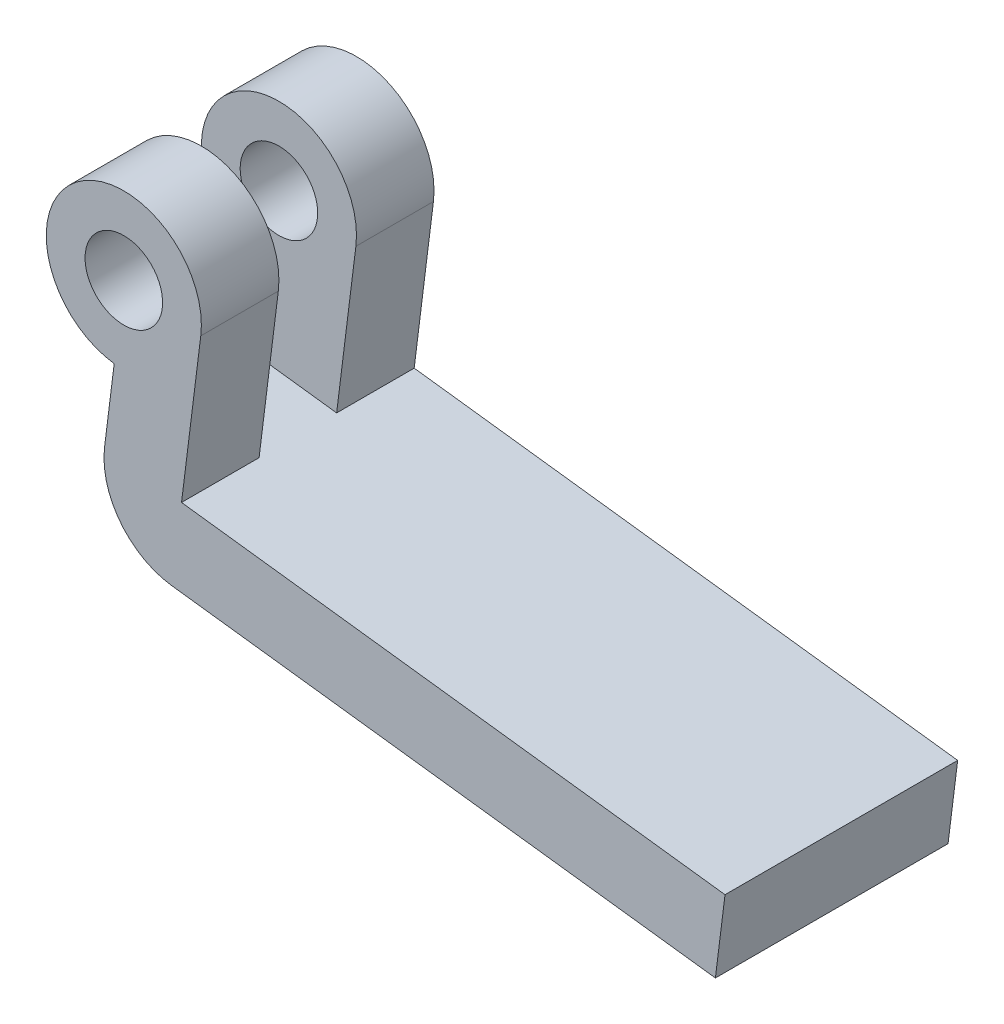
ISO-10303-21;
HEADER;
FILE_DESCRIPTION(('STEP AP214'),'2;1');
FILE_NAME('part.step','',(''),(''),'','','');
FILE_SCHEMA(('AUTOMOTIVE_DESIGN { 1 0 10303 214 1 1 1 1 }'));
ENDSEC;
DATA;
#1=APPLICATION_CONTEXT('core data for automotive mechanical design processes');
#2=APPLICATION_PROTOCOL_DEFINITION('international standard','automotive_design',2000,#1);
#3=PRODUCT_CONTEXT('',#1,'mechanical');
#4=PRODUCT('Part','Part','',(#3));
#5=PRODUCT_RELATED_PRODUCT_CATEGORY('part','',(#4));
#6=PRODUCT_DEFINITION_FORMATION('','',#4);
#7=PRODUCT_DEFINITION_CONTEXT('part definition',#1,'design');
#8=PRODUCT_DEFINITION('design','',#6,#7);
#9=PRODUCT_DEFINITION_SHAPE('','',#8);
#10=(LENGTH_UNIT() NAMED_UNIT(*) SI_UNIT(.MILLI.,.METRE.));
#11=(NAMED_UNIT(*) PLANE_ANGLE_UNIT() SI_UNIT($,.RADIAN.));
#12=(NAMED_UNIT(*) SI_UNIT($,.STERADIAN.) SOLID_ANGLE_UNIT());
#13=UNCERTAINTY_MEASURE_WITH_UNIT(LENGTH_MEASURE(1.E-05),#10,'distance_accuracy_value','');
#14=(GEOMETRIC_REPRESENTATION_CONTEXT(3) GLOBAL_UNCERTAINTY_ASSIGNED_CONTEXT((#13)) GLOBAL_UNIT_ASSIGNED_CONTEXT((#10,
#11,#12)) REPRESENTATION_CONTEXT('',''));
#15=CARTESIAN_POINT('',(0.,0.,0.));
#16=DIRECTION('',(0.,0.,1.));
#17=DIRECTION('',(1.,0.,0.));
#18=AXIS2_PLACEMENT_3D('',#15,#16,#17);
#19=CARTESIAN_POINT('',(-2.3628616939244,-18.9028935513954,9.525));
#20=DIRECTION('',(0.992277876713668,-0.124034734589207,0.));
#21=DIRECTION('',(0.124034734589207,0.992277876713668,0.));
#22=AXIS2_PLACEMENT_3D('',#19,#20,#21);
#23=PLANE('',#22);
#24=DIRECTION('',(-0.124034734589207,-0.992277876713668,0.));
#25=VECTOR('',#24,1.);
#26=CARTESIAN_POINT('',(-2.3628616939244,-18.9028935513954,-9.525));
#27=LINE('',#26,#25);
#28=CARTESIAN_POINT('',(-0.787620564641476,-6.30096451713179,-9.525));
#29=VERTEX_POINT('',#28);
#30=CARTESIAN_POINT('',(-1.57524112928294,-12.6019290342636,-9.525));
#31=VERTEX_POINT('',#30);
#32=EDGE_CURVE('E186',#29,#31,#27,.T.);
#33=ORIENTED_EDGE('',*,*,#32,.T.);
#34=DIRECTION('',(0.,0.,-1.));
#35=VECTOR('',#34,1.);
#36=CARTESIAN_POINT('',(-1.57524112928294,-12.6019290342636,9.525));
#37=LINE('',#36,#35);
#38=CARTESIAN_POINT('',(-1.57524112928294,-12.6019290342636,-3.175));
#39=VERTEX_POINT('',#38);
#40=EDGE_CURVE('E51',#31,#39,#37,.F.);
#41=ORIENTED_EDGE('',*,*,#40,.T.);
#42=DIRECTION('',(0.124034734589207,0.992277876713668,0.));
#43=VECTOR('',#42,1.);
#44=CARTESIAN_POINT('',(-2.3628616939244,-18.9028935513954,-3.175));
#45=LINE('',#44,#43);
#46=CARTESIAN_POINT('',(-0.787620564641472,-6.30096451713179,-3.175));
#47=VERTEX_POINT('',#46);
#48=EDGE_CURVE('E175',#39,#47,#45,.T.);
#49=ORIENTED_EDGE('',*,*,#48,.T.);
#50=DIRECTION('',(0.,0.,-1.));
#51=VECTOR('',#50,1.);
#52=CARTESIAN_POINT('',(-0.787620564641476,-6.30096451713179,9.525));
#53=LINE('',#52,#51);
#54=EDGE_CURVE('E257',#47,#29,#53,.T.);
#55=ORIENTED_EDGE('',*,*,#54,.T.);
#56=EDGE_LOOP('',(#33,#41,#49,#55));
#57=FACE_BOUND('',#56,.T.);
#58=ADVANCED_FACE('F42',(#57),#23,.F.);
#59=CARTESIAN_POINT('',(6.30096451713179,-0.787620564641473,9.525));
#60=DIRECTION('',(-0.992277876713668,0.124034734589208,0.));
#61=DIRECTION('',(-0.124034734589208,-0.992277876713668,0.));
#62=AXIS2_PLACEMENT_3D('',#59,#60,#61);
#63=PLANE('',#62);
#64=DIRECTION('',(-0.124034734589208,-0.992277876713668,0.));
#65=VECTOR('',#64,1.);
#66=CARTESIAN_POINT('',(6.30096451713179,-0.787620564641473,3.175));
#67=LINE('',#66,#65);
#68=CARTESIAN_POINT('',(6.30096451713179,-0.787620564641474,3.175));
#69=VERTEX_POINT('',#68);
#70=CARTESIAN_POINT('',(4.72572338784885,-13.3895495989051,3.175));
#71=VERTEX_POINT('',#70);
#72=EDGE_CURVE('E127',#69,#71,#67,.T.);
#73=ORIENTED_EDGE('',*,*,#72,.F.);
#74=DIRECTION('',(0.,0.,-1.));
#75=VECTOR('',#74,1.);
#76=CARTESIAN_POINT('',(6.30096451713179,-0.787620564641473,9.525));
#77=LINE('',#76,#75);
#78=CARTESIAN_POINT('',(6.30096451713179,-0.787620564641473,9.525));
#79=VERTEX_POINT('',#78);
#80=EDGE_CURVE('E164',#79,#69,#77,.T.);
#81=ORIENTED_EDGE('',*,*,#80,.F.);
#82=DIRECTION('',(0.124034734589208,0.992277876713668,0.));
#83=VECTOR('',#82,1.);
#84=CARTESIAN_POINT('',(6.30096451713179,-0.787620564641473,9.525));
#85=LINE('',#84,#83);
#86=CARTESIAN_POINT('',(4.72572338784885,-13.3895495989051,9.525));
#87=VERTEX_POINT('',#86);
#88=EDGE_CURVE('E154',#87,#79,#85,.T.);
#89=ORIENTED_EDGE('',*,*,#88,.F.);
#90=DIRECTION('',(0.,0.,-1.));
#91=VECTOR('',#90,1.);
#92=CARTESIAN_POINT('',(4.72572338784885,-13.3895495989051,9.525));
#93=LINE('',#92,#91);
#94=EDGE_CURVE('E146',#87,#71,#93,.T.);
#95=ORIENTED_EDGE('',*,*,#94,.T.);
#96=EDGE_LOOP('',(#73,#81,#89,#95));
#97=FACE_BOUND('',#96,.T.);
#98=ADVANCED_FACE('F153',(#97),#63,.F.);
#99=CARTESIAN_POINT('',(0.,0.,9.525));
#100=DIRECTION('',(0.,0.,-1.));
#101=DIRECTION('',(-1.,0.,0.));
#102=AXIS2_PLACEMENT_3D('',#99,#100,#101);
#103=CYLINDRICAL_SURFACE('',#102,6.35);
#104=CARTESIAN_POINT('',(0.,0.,3.175));
#105=DIRECTION('',(0.,0.,-1.));
#106=DIRECTION('',(-1.,0.,0.));
#107=AXIS2_PLACEMENT_3D('',#104,#105,#106);
#108=CIRCLE('',#107,6.35);
#109=CARTESIAN_POINT('',(-0.787620564641472,-6.30096451713179,3.175));
#110=VERTEX_POINT('',#109);
#111=EDGE_CURVE('E133',#110,#69,#108,.T.);
#112=ORIENTED_EDGE('',*,*,#111,.F.);
#113=CARTESIAN_POINT('',(-0.787620564641476,-6.30096451713179,9.525));
#114=VERTEX_POINT('',#113);
#115=EDGE_CURVE('E258',#114,#110,#53,.T.);
#116=ORIENTED_EDGE('',*,*,#115,.F.);
#117=CARTESIAN_POINT('',(0.,0.,9.525));
#118=DIRECTION('',(0.,0.,1.));
#119=DIRECTION('',(1.,0.,0.));
#120=AXIS2_PLACEMENT_3D('',#117,#118,#119);
#121=CIRCLE('',#120,6.35);
#122=EDGE_CURVE('E221',#79,#114,#121,.T.);
#123=ORIENTED_EDGE('',*,*,#122,.F.);
#124=ORIENTED_EDGE('',*,*,#80,.T.);
#125=EDGE_LOOP('',(#112,#116,#123,#124));
#126=FACE_BOUND('',#125,.T.);
#127=ADVANCED_FACE('F298',(#126),#103,.T.);
#128=CARTESIAN_POINT('',(0.,0.,9.525));
#129=DIRECTION('',(0.,0.,-1.));
#130=DIRECTION('',(-1.,0.,0.));
#131=AXIS2_PLACEMENT_3D('',#128,#129,#130);
#132=CYLINDRICAL_SURFACE('',#131,3.175);
#133=CARTESIAN_POINT('',(0.,0.,9.525));
#134=DIRECTION('',(0.,0.,1.));
#135=DIRECTION('',(1.,0.,0.));
#136=AXIS2_PLACEMENT_3D('',#133,#134,#135);
#137=CIRCLE('',#136,3.175);
#138=CARTESIAN_POINT('',(-3.175,0.,9.525));
#139=VERTEX_POINT('',#138);
#140=EDGE_CURVE('E206',#139,#139,#137,.T.);
#141=CARTESIAN_POINT('',(0.,0.,3.175));
#142=DIRECTION('',(0.,0.,-1.));
#143=DIRECTION('',(-1.,0.,0.));
#144=AXIS2_PLACEMENT_3D('',#141,#142,#143);
#145=CIRCLE('',#144,3.175);
#146=CARTESIAN_POINT('',(-3.175,0.,3.175));
#147=VERTEX_POINT('',#146);
#148=EDGE_CURVE('E168',#147,#147,#145,.T.);
#149=CARTESIAN_POINT('',(-3.175,0.,9.525));
#150=CARTESIAN_POINT('',(-3.175,0.,9.45885416666667));
#151=CARTESIAN_POINT('',(-3.175,0.,9.39270833333333));
#152=CARTESIAN_POINT('',(-3.175,0.,9.26041666666667));
#153=CARTESIAN_POINT('',(-3.175,0.,9.19427083333333));
#154=CARTESIAN_POINT('',(-3.175,0.,9.06197916666667));
#155=CARTESIAN_POINT('',(-3.175,0.,8.99583333333333));
#156=CARTESIAN_POINT('',(-3.175,0.,8.86354166666667));
#157=CARTESIAN_POINT('',(-3.175,0.,8.79739583333333));
#158=CARTESIAN_POINT('',(-3.175,0.,8.66510416666667));
#159=CARTESIAN_POINT('',(-3.175,0.,8.59895833333333));
#160=CARTESIAN_POINT('',(-3.175,0.,8.46666666666667));
#161=CARTESIAN_POINT('',(-3.175,0.,8.40052083333333));
#162=CARTESIAN_POINT('',(-3.175,0.,8.26822916666667));
#163=CARTESIAN_POINT('',(-3.175,0.,8.20208333333333));
#164=CARTESIAN_POINT('',(-3.175,0.,8.06979166666667));
#165=CARTESIAN_POINT('',(-3.175,0.,8.00364583333333));
#166=CARTESIAN_POINT('',(-3.175,0.,7.87135416666667));
#167=CARTESIAN_POINT('',(-3.175,0.,7.80520833333333));
#168=CARTESIAN_POINT('',(-3.175,0.,7.67291666666667));
#169=CARTESIAN_POINT('',(-3.175,0.,7.60677083333333));
#170=CARTESIAN_POINT('',(-3.175,0.,7.47447916666667));
#171=CARTESIAN_POINT('',(-3.175,0.,7.40833333333333));
#172=CARTESIAN_POINT('',(-3.175,0.,7.27604166666667));
#173=CARTESIAN_POINT('',(-3.175,0.,7.20989583333333));
#174=CARTESIAN_POINT('',(-3.175,0.,7.07760416666667));
#175=CARTESIAN_POINT('',(-3.175,0.,7.01145833333333));
#176=CARTESIAN_POINT('',(-3.175,0.,6.87916666666667));
#177=CARTESIAN_POINT('',(-3.175,0.,6.81302083333333));
#178=CARTESIAN_POINT('',(-3.175,0.,6.68072916666667));
#179=CARTESIAN_POINT('',(-3.175,0.,6.61458333333333));
#180=CARTESIAN_POINT('',(-3.175,0.,6.48229166666667));
#181=CARTESIAN_POINT('',(-3.175,0.,6.41614583333333));
#182=CARTESIAN_POINT('',(-3.175,0.,6.28385416666667));
#183=CARTESIAN_POINT('',(-3.175,0.,6.21770833333333));
#184=CARTESIAN_POINT('',(-3.175,0.,6.08541666666667));
#185=CARTESIAN_POINT('',(-3.175,0.,6.01927083333333));
#186=CARTESIAN_POINT('',(-3.175,0.,5.88697916666667));
#187=CARTESIAN_POINT('',(-3.175,0.,5.82083333333333));
#188=CARTESIAN_POINT('',(-3.175,0.,5.68854166666667));
#189=CARTESIAN_POINT('',(-3.175,0.,5.62239583333333));
#190=CARTESIAN_POINT('',(-3.175,0.,5.49010416666667));
#191=CARTESIAN_POINT('',(-3.175,0.,5.42395833333333));
#192=CARTESIAN_POINT('',(-3.175,0.,5.29166666666667));
#193=CARTESIAN_POINT('',(-3.175,0.,5.22552083333333));
#194=CARTESIAN_POINT('',(-3.175,0.,5.09322916666667));
#195=CARTESIAN_POINT('',(-3.175,0.,5.02708333333333));
#196=CARTESIAN_POINT('',(-3.175,0.,4.89479166666667));
#197=CARTESIAN_POINT('',(-3.175,0.,4.82864583333333));
#198=CARTESIAN_POINT('',(-3.175,0.,4.69635416666667));
#199=CARTESIAN_POINT('',(-3.175,0.,4.63020833333333));
#200=CARTESIAN_POINT('',(-3.175,0.,4.49791666666667));
#201=CARTESIAN_POINT('',(-3.175,0.,4.43177083333333));
#202=CARTESIAN_POINT('',(-3.175,0.,4.29947916666667));
#203=CARTESIAN_POINT('',(-3.175,0.,4.23333333333333));
#204=CARTESIAN_POINT('',(-3.175,0.,4.10104166666667));
#205=CARTESIAN_POINT('',(-3.175,0.,4.03489583333333));
#206=CARTESIAN_POINT('',(-3.175,0.,3.90260416666667));
#207=CARTESIAN_POINT('',(-3.175,0.,3.83645833333333));
#208=CARTESIAN_POINT('',(-3.175,0.,3.70416666666667));
#209=CARTESIAN_POINT('',(-3.175,0.,3.63802083333333));
#210=CARTESIAN_POINT('',(-3.175,0.,3.50572916666667));
#211=CARTESIAN_POINT('',(-3.175,0.,3.43958333333333));
#212=CARTESIAN_POINT('',(-3.175,0.,3.30729166666667));
#213=CARTESIAN_POINT('',(-3.175,0.,3.24114583333334));
#214=CARTESIAN_POINT('',(-3.175,0.,3.175));
#215=B_SPLINE_CURVE_WITH_KNOTS('',3,(#149,#150,#151,#152,#153,#154,#155,#156,#157,#158,#159,
#160,#161,#162,#163,#164,#165,#166,#167,#168,#169,#170,#171,#172,#173,#174,#175,#176,#177,#178,
#179,#180,#181,#182,#183,#184,#185,#186,#187,#188,#189,#190,#191,#192,#193,#194,#195,#196,#197,
#198,#199,#200,#201,#202,#203,#204,#205,#206,#207,#208,#209,#210,#211,#212,#213,#214),
.UNSPECIFIED.,.F.,.F.,(4,2,2,2,2,2,2,2,2,2,2,2,2,2,2,2,2,2,2,2,2,2,2,2,2,2,2,2,2,2,2,2,4),(0.,
0.198437500000001,0.396875000000001,0.5953125,0.793750000000001,0.9921875,1.190625,1.3890625,
1.5875,1.7859375,1.984375,2.1828125,2.38125,2.5796875,2.778125,2.9765625,3.175,3.3734375,
3.571875,3.7703125,3.96875,4.1671875,4.365625,4.5640625,4.7625,4.9609375,5.159375,5.3578125,
5.55625,5.7546875,5.953125,6.1515625,6.35),.UNSPECIFIED.);
#216=EDGE_CURVE('BSEAM283',#139,#147,#215,.T.);
#217=ORIENTED_EDGE('',*,*,#140,.T.);
#218=ORIENTED_EDGE('',*,*,#148,.T.);
#219=ORIENTED_EDGE('',*,*,#216,.T.);
#220=ORIENTED_EDGE('',*,*,#216,.F.);
#221=EDGE_LOOP('',(#217,#219,#218,#220));
#222=FACE_BOUND('',#221,.T.);
#223=ADVANCED_FACE('F283',(#222),#132,.F.);
#224=CARTESIAN_POINT('',(0.,0.,9.525));
#225=DIRECTION('',(0.,0.,1.));
#226=DIRECTION('',(1.,0.,0.));
#227=AXIS2_PLACEMENT_3D('',#224,#225,#226);
#228=PLANE('',#227);
#229=DIRECTION('',(-0.124034734589207,-0.992277876713668,0.));
#230=VECTOR('',#229,1.);
#231=CARTESIAN_POINT('',(-2.3628616939244,-18.9028935513954,9.525));
#232=LINE('',#231,#230);
#233=CARTESIAN_POINT('',(-1.57524112928294,-12.6019290342636,9.525));
#234=VERTEX_POINT('',#233);
#235=EDGE_CURVE('E224',#114,#234,#232,.T.);
#236=ORIENTED_EDGE('',*,*,#235,.T.);
#237=CARTESIAN_POINT('',(4.72572338784885,-13.3895495989051,9.525));
#238=DIRECTION('',(0.,0.,1.));
#239=DIRECTION('',(1.,0.,0.));
#240=AXIS2_PLACEMENT_3D('',#237,#238,#239);
#241=CIRCLE('',#240,6.35);
#242=CARTESIAN_POINT('',(3.93810282320738,-19.6905141160368,9.525));
#243=VERTEX_POINT('',#242);
#244=EDGE_CURVE('E11',#234,#243,#241,.T.);
#245=ORIENTED_EDGE('',*,*,#244,.T.);
#246=DIRECTION('',(0.992277876713668,-0.124034734589208,0.));
#247=VECTOR('',#246,1.);
#248=CARTESIAN_POINT('',(48.4371383060756,-25.2528935513953,9.525));
#249=LINE('',#248,#247);
#250=CARTESIAN_POINT('',(48.4371383060756,-25.2528935513953,9.525));
#251=VERTEX_POINT('',#250);
#252=EDGE_CURVE('E227',#243,#251,#249,.T.);
#253=ORIENTED_EDGE('',*,*,#252,.T.);
#254=DIRECTION('',(0.124034734589208,0.992277876713668,0.));
#255=VECTOR('',#254,1.);
#256=CARTESIAN_POINT('',(49.2247588707171,-18.9519290342636,9.525));
#257=LINE('',#256,#255);
#258=CARTESIAN_POINT('',(49.2247588707171,-18.9519290342636,9.525));
#259=VERTEX_POINT('',#258);
#260=EDGE_CURVE('E230',#251,#259,#257,.T.);
#261=ORIENTED_EDGE('',*,*,#260,.T.);
#262=DIRECTION('',(-0.992277876713668,0.124034734589208,0.));
#263=VECTOR('',#262,1.);
#264=CARTESIAN_POINT('',(4.72572338784885,-13.3895495989051,9.525));
#265=LINE('',#264,#263);
#266=EDGE_CURVE('E215',#259,#87,#265,.T.);
#267=ORIENTED_EDGE('',*,*,#266,.T.);
#268=ORIENTED_EDGE('',*,*,#88,.T.);
#269=ORIENTED_EDGE('',*,*,#122,.T.);
#270=EDGE_LOOP('',(#236,#245,#253,#261,#267,#268,#269));
#271=FACE_BOUND('',#270,.T.);
#272=ORIENTED_EDGE('',*,*,#140,.F.);
#273=EDGE_LOOP('',(#272));
#274=FACE_BOUND('',#273,.T.);
#275=ADVANCED_FACE('F274',(#271,#274),#228,.T.);
#276=CARTESIAN_POINT('',(0.,0.,-9.525));
#277=DIRECTION('',(0.,0.,1.));
#278=DIRECTION('',(1.,0.,0.));
#279=AXIS2_PLACEMENT_3D('',#276,#277,#278);
#280=PLANE('',#279);
#281=DIRECTION('',(0.992277876713668,-0.124034734589208,0.));
#282=VECTOR('',#281,1.);
#283=CARTESIAN_POINT('',(48.4371383060756,-25.2528935513953,-9.525));
#284=LINE('',#283,#282);
#285=CARTESIAN_POINT('',(3.93810282320738,-19.6905141160368,-9.525));
#286=VERTEX_POINT('',#285);
#287=CARTESIAN_POINT('',(48.4371383060756,-25.2528935513953,-9.525));
#288=VERTEX_POINT('',#287);
#289=EDGE_CURVE('E246',#286,#288,#284,.T.);
#290=ORIENTED_EDGE('',*,*,#289,.F.);
#291=CARTESIAN_POINT('',(4.72572338784885,-13.3895495989051,-9.525));
#292=DIRECTION('',(0.,0.,1.));
#293=DIRECTION('',(1.,0.,0.));
#294=AXIS2_PLACEMENT_3D('',#291,#292,#293);
#295=CIRCLE('',#294,6.35);
#296=EDGE_CURVE('E66',#286,#31,#295,.F.);
#297=ORIENTED_EDGE('',*,*,#296,.T.);
#298=ORIENTED_EDGE('',*,*,#32,.F.);
#299=CARTESIAN_POINT('',(0.,0.,-9.525));
#300=DIRECTION('',(0.,0.,1.));
#301=DIRECTION('',(1.,0.,0.));
#302=AXIS2_PLACEMENT_3D('',#299,#300,#301);
#303=CIRCLE('',#302,6.35);
#304=CARTESIAN_POINT('',(6.30096451713179,-0.787620564641473,-9.525));
#305=VERTEX_POINT('',#304);
#306=EDGE_CURVE('E240',#305,#29,#303,.T.);
#307=ORIENTED_EDGE('',*,*,#306,.F.);
#308=DIRECTION('',(0.124034734589208,0.992277876713668,0.));
#309=VECTOR('',#308,1.);
#310=CARTESIAN_POINT('',(6.30096451713179,-0.787620564641473,-9.525));
#311=LINE('',#310,#309);
#312=CARTESIAN_POINT('',(4.72572338784885,-13.3895495989051,-9.525));
#313=VERTEX_POINT('',#312);
#314=EDGE_CURVE('E236',#313,#305,#311,.T.);
#315=ORIENTED_EDGE('',*,*,#314,.F.);
#316=DIRECTION('',(-0.992277876713668,0.124034734589208,0.));
#317=VECTOR('',#316,1.);
#318=CARTESIAN_POINT('',(4.72572338784885,-13.3895495989051,-9.525));
#319=LINE('',#318,#317);
#320=CARTESIAN_POINT('',(49.2247588707171,-18.9519290342636,-9.525));
#321=VERTEX_POINT('',#320);
#322=EDGE_CURVE('E213',#321,#313,#319,.T.);
#323=ORIENTED_EDGE('',*,*,#322,.F.);
#324=DIRECTION('',(0.124034734589208,0.992277876713668,0.));
#325=VECTOR('',#324,1.);
#326=CARTESIAN_POINT('',(49.2247588707171,-18.9519290342636,-9.525));
#327=LINE('',#326,#325);
#328=EDGE_CURVE('E218',#288,#321,#327,.T.);
#329=ORIENTED_EDGE('',*,*,#328,.F.);
#330=EDGE_LOOP('',(#290,#297,#298,#307,#315,#323,#329));
#331=FACE_BOUND('',#330,.T.);
#332=CARTESIAN_POINT('',(0.,0.,-9.525));
#333=DIRECTION('',(0.,0.,1.));
#334=DIRECTION('',(1.,0.,0.));
#335=AXIS2_PLACEMENT_3D('',#332,#333,#334);
#336=CIRCLE('',#335,3.175);
#337=CARTESIAN_POINT('',(-3.175,0.,-9.525));
#338=VERTEX_POINT('',#337);
#339=EDGE_CURVE('E200',#338,#338,#336,.T.);
#340=ORIENTED_EDGE('',*,*,#339,.T.);
#341=EDGE_LOOP('',(#340));
#342=FACE_BOUND('',#341,.T.);
#343=ADVANCED_FACE('F270',(#331,#342),#280,.F.);
#344=CARTESIAN_POINT('',(4.72572338784885,-13.3895495989051,9.525));
#345=DIRECTION('',(-0.124034734589208,-0.992277876713668,0.));
#346=DIRECTION('',(0.992277876713668,-0.124034734589208,0.));
#347=AXIS2_PLACEMENT_3D('',#344,#345,#346);
#348=PLANE('',#347);
#349=CARTESIAN_POINT('',(4.72572338784885,-13.3895495989051,-3.175));
#350=VERTEX_POINT('',#349);
#351=EDGE_CURVE('E158',#350,#313,#93,.T.);
#352=ORIENTED_EDGE('',*,*,#351,.F.);
#353=DIRECTION('',(0.992277876713668,-0.124034734589208,0.));
#354=VECTOR('',#353,1.);
#355=CARTESIAN_POINT('',(49.2247588707171,-18.9519290342636,-3.175));
#356=LINE('',#355,#354);
#357=EDGE_CURVE('E151',#39,#350,#356,.T.);
#358=ORIENTED_EDGE('',*,*,#357,.F.);
#359=DIRECTION('',(0.,0.,-1.));
#360=VECTOR('',#359,1.);
#361=CARTESIAN_POINT('',(-1.57524112928294,-12.6019290342636,9.525));
#362=LINE('',#361,#360);
#363=CARTESIAN_POINT('',(-1.57524112928294,-12.6019290342636,3.175));
#364=VERTEX_POINT('',#363);
#365=EDGE_CURVE('E149',#364,#39,#362,.T.);
#366=ORIENTED_EDGE('',*,*,#365,.F.);
#367=DIRECTION('',(0.992277876713668,-0.124034734589208,0.));
#368=VECTOR('',#367,1.);
#369=CARTESIAN_POINT('',(49.2247588707171,-18.9519290342636,3.175));
#370=LINE('',#369,#368);
#371=EDGE_CURVE('E130',#364,#71,#370,.T.);
#372=ORIENTED_EDGE('',*,*,#371,.T.);
#373=ORIENTED_EDGE('',*,*,#94,.F.);
#374=ORIENTED_EDGE('',*,*,#266,.F.);
#375=DIRECTION('',(0.,0.,-1.));
#376=VECTOR('',#375,1.);
#377=CARTESIAN_POINT('',(49.2247588707171,-18.9519290342636,9.525));
#378=LINE('',#377,#376);
#379=EDGE_CURVE('E233',#259,#321,#378,.T.);
#380=ORIENTED_EDGE('',*,*,#379,.T.);
#381=ORIENTED_EDGE('',*,*,#322,.T.);
#382=EDGE_LOOP('',(#352,#358,#366,#372,#373,#374,#380,#381));
#383=FACE_BOUND('',#382,.T.);
#384=ADVANCED_FACE('F144',(#383),#348,.F.);
#385=CARTESIAN_POINT('',(6.30096451713179,-0.787620564641474,-3.175));
#386=VERTEX_POINT('',#385);
#387=EDGE_CURVE('E261',#386,#305,#77,.T.);
#388=ORIENTED_EDGE('',*,*,#387,.F.);
#389=DIRECTION('',(-0.124034734589208,-0.992277876713668,0.));
#390=VECTOR('',#389,1.);
#391=CARTESIAN_POINT('',(6.30096451713179,-0.787620564641473,-3.175));
#392=LINE('',#391,#390);
#393=EDGE_CURVE('E201',#386,#350,#392,.T.);
#394=ORIENTED_EDGE('',*,*,#393,.T.);
#395=ORIENTED_EDGE('',*,*,#351,.T.);
#396=ORIENTED_EDGE('',*,*,#314,.T.);
#397=EDGE_LOOP('',(#388,#394,#395,#396));
#398=FACE_BOUND('',#397,.T.);
#399=ADVANCED_FACE('F308',(#398),#63,.F.);
#400=ORIENTED_EDGE('',*,*,#54,.F.);
#401=CARTESIAN_POINT('',(0.,0.,-3.175));
#402=DIRECTION('',(0.,0.,-1.));
#403=DIRECTION('',(-1.,0.,0.));
#404=AXIS2_PLACEMENT_3D('',#401,#402,#403);
#405=CIRCLE('',#404,6.35);
#406=EDGE_CURVE('E192',#47,#386,#405,.T.);
#407=ORIENTED_EDGE('',*,*,#406,.T.);
#408=ORIENTED_EDGE('',*,*,#387,.T.);
#409=ORIENTED_EDGE('',*,*,#306,.T.);
#410=EDGE_LOOP('',(#400,#407,#408,#409));
#411=FACE_BOUND('',#410,.T.);
#412=ADVANCED_FACE('F267',(#411),#103,.T.);
#413=DIRECTION('',(0.124034734589207,0.992277876713668,0.));
#414=VECTOR('',#413,1.);
#415=CARTESIAN_POINT('',(-2.3628616939244,-18.9028935513954,3.175));
#416=LINE('',#415,#414);
#417=EDGE_CURVE('E172',#364,#110,#416,.T.);
#418=ORIENTED_EDGE('',*,*,#417,.F.);
#419=DIRECTION('',(0.,0.,-1.));
#420=VECTOR('',#419,1.);
#421=CARTESIAN_POINT('',(-1.57524112928294,-12.6019290342636,9.525));
#422=LINE('',#421,#420);
#423=EDGE_CURVE('E58',#364,#234,#422,.F.);
#424=ORIENTED_EDGE('',*,*,#423,.T.);
#425=ORIENTED_EDGE('',*,*,#235,.F.);
#426=ORIENTED_EDGE('',*,*,#115,.T.);
#427=EDGE_LOOP('',(#418,#424,#425,#426));
#428=FACE_BOUND('',#427,.T.);
#429=ADVANCED_FACE('F302',(#428),#23,.F.);
#430=CARTESIAN_POINT('',(48.4371383060756,-25.2528935513953,9.525));
#431=DIRECTION('',(0.124034734589208,0.992277876713668,0.));
#432=DIRECTION('',(-0.992277876713668,0.124034734589208,0.));
#433=AXIS2_PLACEMENT_3D('',#430,#431,#432);
#434=PLANE('',#433);
#435=ORIENTED_EDGE('',*,*,#252,.F.);
#436=DIRECTION('',(0.,0.,-1.));
#437=VECTOR('',#436,1.);
#438=CARTESIAN_POINT('',(3.93810282320738,-19.6905141160368,9.525));
#439=LINE('',#438,#437);
#440=EDGE_CURVE('E157',#243,#286,#439,.T.);
#441=ORIENTED_EDGE('',*,*,#440,.T.);
#442=ORIENTED_EDGE('',*,*,#289,.T.);
#443=DIRECTION('',(0.,0.,-1.));
#444=VECTOR('',#443,1.);
#445=CARTESIAN_POINT('',(48.4371383060756,-25.2528935513953,9.525));
#446=LINE('',#445,#444);
#447=EDGE_CURVE('E254',#251,#288,#446,.T.);
#448=ORIENTED_EDGE('',*,*,#447,.F.);
#449=EDGE_LOOP('',(#435,#441,#442,#448));
#450=FACE_BOUND('',#449,.T.);
#451=ADVANCED_FACE('F291',(#450),#434,.F.);
#452=CARTESIAN_POINT('',(49.2247588707171,-18.9519290342636,9.525));
#453=DIRECTION('',(-0.992277876713668,0.124034734589208,0.));
#454=DIRECTION('',(-0.124034734589208,-0.992277876713668,0.));
#455=AXIS2_PLACEMENT_3D('',#452,#453,#454);
#456=PLANE('',#455);
#457=ORIENTED_EDGE('',*,*,#328,.T.);
#458=ORIENTED_EDGE('',*,*,#379,.F.);
#459=ORIENTED_EDGE('',*,*,#260,.F.);
#460=ORIENTED_EDGE('',*,*,#447,.T.);
#461=EDGE_LOOP('',(#457,#458,#459,#460));
#462=FACE_BOUND('',#461,.T.);
#463=ADVANCED_FACE('F280',(#462),#456,.F.);
#464=CARTESIAN_POINT('',(0.,0.,-3.175));
#465=DIRECTION('',(0.,0.,-1.));
#466=DIRECTION('',(-1.,0.,0.));
#467=AXIS2_PLACEMENT_3D('',#464,#465,#466);
#468=CIRCLE('',#467,3.175);
#469=CARTESIAN_POINT('',(-3.175,0.,-3.175));
#470=VERTEX_POINT('',#469);
#471=EDGE_CURVE('E139',#470,#470,#468,.T.);
#472=CARTESIAN_POINT('',(-3.175,0.,-3.175));
#473=CARTESIAN_POINT('',(-3.175,0.,-3.24114583333333));
#474=CARTESIAN_POINT('',(-3.175,0.,-3.30729166666666));
#475=CARTESIAN_POINT('',(-3.175,0.,-3.43958333333333));
#476=CARTESIAN_POINT('',(-3.175,0.,-3.50572916666666));
#477=CARTESIAN_POINT('',(-3.175,0.,-3.63802083333333));
#478=CARTESIAN_POINT('',(-3.175,0.,-3.70416666666666));
#479=CARTESIAN_POINT('',(-3.175,0.,-3.83645833333333));
#480=CARTESIAN_POINT('',(-3.175,0.,-3.90260416666667));
#481=CARTESIAN_POINT('',(-3.175,0.,-4.03489583333333));
#482=CARTESIAN_POINT('',(-3.175,0.,-4.10104166666667));
#483=CARTESIAN_POINT('',(-3.175,0.,-4.23333333333333));
#484=CARTESIAN_POINT('',(-3.175,0.,-4.29947916666667));
#485=CARTESIAN_POINT('',(-3.175,0.,-4.43177083333333));
#486=CARTESIAN_POINT('',(-3.175,0.,-4.49791666666667));
#487=CARTESIAN_POINT('',(-3.175,0.,-4.63020833333333));
#488=CARTESIAN_POINT('',(-3.175,0.,-4.69635416666667));
#489=CARTESIAN_POINT('',(-3.175,0.,-4.82864583333333));
#490=CARTESIAN_POINT('',(-3.175,0.,-4.89479166666667));
#491=CARTESIAN_POINT('',(-3.175,0.,-5.02708333333333));
#492=CARTESIAN_POINT('',(-3.175,0.,-5.09322916666667));
#493=CARTESIAN_POINT('',(-3.175,0.,-5.22552083333333));
#494=CARTESIAN_POINT('',(-3.175,0.,-5.29166666666667));
#495=CARTESIAN_POINT('',(-3.175,0.,-5.42395833333333));
#496=CARTESIAN_POINT('',(-3.175,0.,-5.49010416666667));
#497=CARTESIAN_POINT('',(-3.175,0.,-5.62239583333333));
#498=CARTESIAN_POINT('',(-3.175,0.,-5.68854166666667));
#499=CARTESIAN_POINT('',(-3.175,0.,-5.82083333333333));
#500=CARTESIAN_POINT('',(-3.175,0.,-5.88697916666667));
#501=CARTESIAN_POINT('',(-3.175,0.,-6.01927083333333));
#502=CARTESIAN_POINT('',(-3.175,0.,-6.08541666666667));
#503=CARTESIAN_POINT('',(-3.175,0.,-6.21770833333333));
#504=CARTESIAN_POINT('',(-3.175,0.,-6.28385416666666));
#505=CARTESIAN_POINT('',(-3.175,0.,-6.41614583333333));
#506=CARTESIAN_POINT('',(-3.175,0.,-6.48229166666667));
#507=CARTESIAN_POINT('',(-3.175,0.,-6.61458333333333));
#508=CARTESIAN_POINT('',(-3.175,0.,-6.68072916666666));
#509=CARTESIAN_POINT('',(-3.175,0.,-6.81302083333333));
#510=CARTESIAN_POINT('',(-3.175,0.,-6.87916666666666));
#511=CARTESIAN_POINT('',(-3.175,0.,-7.01145833333333));
#512=CARTESIAN_POINT('',(-3.175,0.,-7.07760416666667));
#513=CARTESIAN_POINT('',(-3.175,0.,-7.20989583333333));
#514=CARTESIAN_POINT('',(-3.175,0.,-7.27604166666667));
#515=CARTESIAN_POINT('',(-3.175,0.,-7.40833333333333));
#516=CARTESIAN_POINT('',(-3.175,0.,-7.47447916666666));
#517=CARTESIAN_POINT('',(-3.175,0.,-7.60677083333333));
#518=CARTESIAN_POINT('',(-3.175,0.,-7.67291666666667));
#519=CARTESIAN_POINT('',(-3.175,0.,-7.80520833333333));
#520=CARTESIAN_POINT('',(-3.175,0.,-7.87135416666667));
#521=CARTESIAN_POINT('',(-3.175,0.,-8.00364583333333));
#522=CARTESIAN_POINT('',(-3.175,0.,-8.06979166666666));
#523=CARTESIAN_POINT('',(-3.175,0.,-8.20208333333333));
#524=CARTESIAN_POINT('',(-3.175,0.,-8.26822916666666));
#525=CARTESIAN_POINT('',(-3.175,0.,-8.40052083333333));
#526=CARTESIAN_POINT('',(-3.175,0.,-8.46666666666667));
#527=CARTESIAN_POINT('',(-3.175,0.,-8.59895833333333));
#528=CARTESIAN_POINT('',(-3.175,0.,-8.66510416666666));
#529=CARTESIAN_POINT('',(-3.175,0.,-8.79739583333333));
#530=CARTESIAN_POINT('',(-3.175,0.,-8.86354166666666));
#531=CARTESIAN_POINT('',(-3.175,0.,-8.99583333333333));
#532=CARTESIAN_POINT('',(-3.175,0.,-9.06197916666667));
#533=CARTESIAN_POINT('',(-3.175,0.,-9.19427083333333));
#534=CARTESIAN_POINT('',(-3.175,0.,-9.26041666666667));
#535=CARTESIAN_POINT('',(-3.175,0.,-9.39270833333333));
#536=CARTESIAN_POINT('',(-3.175,0.,-9.45885416666667));
#537=CARTESIAN_POINT('',(-3.175,0.,-9.525));
#538=B_SPLINE_CURVE_WITH_KNOTS('',3,(#472,#473,#474,#475,#476,#477,#478,#479,#480,#481,#482,
#483,#484,#485,#486,#487,#488,#489,#490,#491,#492,#493,#494,#495,#496,#497,#498,#499,#500,#501,
#502,#503,#504,#505,#506,#507,#508,#509,#510,#511,#512,#513,#514,#515,#516,#517,#518,#519,#520,
#521,#522,#523,#524,#525,#526,#527,#528,#529,#530,#531,#532,#533,#534,#535,#536,#537),
.UNSPECIFIED.,.F.,.F.,(4,2,2,2,2,2,2,2,2,2,2,2,2,2,2,2,2,2,2,2,2,2,2,2,2,2,2,2,2,2,2,2,4),(0.,
0.198437500000001,0.396875,0.5953125,0.793750000000001,0.992187500000002,1.190625,1.3890625,
1.5875,1.7859375,1.984375,2.1828125,2.38125,2.5796875,2.778125,2.9765625,3.175,3.3734375,
3.571875,3.7703125,3.96875,4.1671875,4.365625,4.5640625,4.7625,4.9609375,5.159375,5.3578125,
5.55625,5.7546875,5.953125,6.1515625,6.35),.UNSPECIFIED.);
#539=EDGE_CURVE('BSEAM278',#470,#338,#538,.T.);
#540=ORIENTED_EDGE('',*,*,#471,.F.);
#541=ORIENTED_EDGE('',*,*,#339,.F.);
#542=ORIENTED_EDGE('',*,*,#539,.T.);
#543=ORIENTED_EDGE('',*,*,#539,.F.);
#544=EDGE_LOOP('',(#540,#542,#541,#543));
#545=FACE_BOUND('',#544,.T.);
#546=ADVANCED_FACE('F278',(#545),#132,.F.);
#547=CARTESIAN_POINT('',(0.,0.,-3.175));
#548=DIRECTION('',(0.,0.,-1.));
#549=DIRECTION('',(-1.,0.,0.));
#550=AXIS2_PLACEMENT_3D('',#547,#548,#549);
#551=PLANE('',#550);
#552=ORIENTED_EDGE('',*,*,#471,.T.);
#553=EDGE_LOOP('',(#552));
#554=FACE_BOUND('',#553,.T.);
#555=ORIENTED_EDGE('',*,*,#406,.F.);
#556=ORIENTED_EDGE('',*,*,#48,.F.);
#557=ORIENTED_EDGE('',*,*,#357,.T.);
#558=ORIENTED_EDGE('',*,*,#393,.F.);
#559=EDGE_LOOP('',(#555,#556,#557,#558));
#560=FACE_BOUND('',#559,.T.);
#561=ADVANCED_FACE('F189',(#554,#560),#551,.F.);
#562=CARTESIAN_POINT('',(0.,0.,3.175));
#563=DIRECTION('',(0.,0.,-1.));
#564=DIRECTION('',(-1.,0.,0.));
#565=AXIS2_PLACEMENT_3D('',#562,#563,#564);
#566=PLANE('',#565);
#567=ORIENTED_EDGE('',*,*,#148,.F.);
#568=EDGE_LOOP('',(#567));
#569=FACE_BOUND('',#568,.T.);
#570=ORIENTED_EDGE('',*,*,#72,.T.);
#571=ORIENTED_EDGE('',*,*,#371,.F.);
#572=ORIENTED_EDGE('',*,*,#417,.T.);
#573=ORIENTED_EDGE('',*,*,#111,.T.);
#574=EDGE_LOOP('',(#570,#571,#572,#573));
#575=FACE_BOUND('',#574,.T.);
#576=ADVANCED_FACE('F129',(#569,#575),#566,.T.);
#577=CARTESIAN_POINT('',(4.72572338784885,-13.3895495989051,9.525));
#578=DIRECTION('',(0.,0.,-1.));
#579=DIRECTION('',(-1.,0.,0.));
#580=AXIS2_PLACEMENT_3D('',#577,#578,#579);
#581=CYLINDRICAL_SURFACE('',#580,6.35);
#582=ORIENTED_EDGE('',*,*,#365,.T.);
#583=ORIENTED_EDGE('',*,*,#40,.F.);
#584=ORIENTED_EDGE('',*,*,#296,.F.);
#585=ORIENTED_EDGE('',*,*,#440,.F.);
#586=ORIENTED_EDGE('',*,*,#244,.F.);
#587=ORIENTED_EDGE('',*,*,#423,.F.);
#588=EDGE_LOOP('',(#582,#583,#584,#585,#586,#587));
#589=FACE_BOUND('',#588,.T.);
#590=ADVANCED_FACE('F44',(#589),#581,.T.);
#591=CLOSED_SHELL('',(#58,#98,#127,#223,#275,#343,#384,#399,#412,#429,#451,#463,#546,#561,#576,#590));
#592=MANIFOLD_SOLID_BREP('B2',#591);
#593=ADVANCED_BREP_SHAPE_REPRESENTATION('',(#18,#592),#14);
#594=SHAPE_DEFINITION_REPRESENTATION(#9,#593);
ENDSEC;
END-ISO-10303-21;
